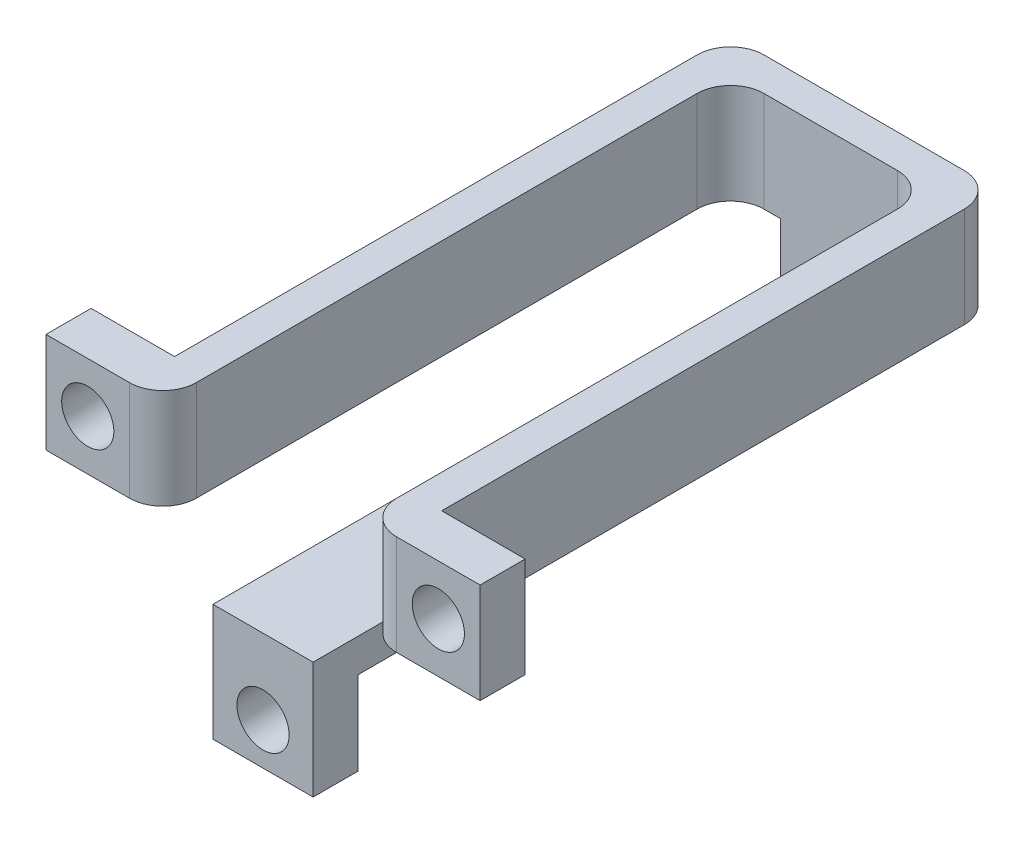
ISO-10303-21;
HEADER;
FILE_DESCRIPTION(('STEP AP214'),'2;1');
FILE_NAME('part.step','',(''),(''),'','','');
FILE_SCHEMA(('AUTOMOTIVE_DESIGN { 1 0 10303 214 1 1 1 1 }'));
ENDSEC;
DATA;
#1=APPLICATION_CONTEXT('core data for automotive mechanical design processes');
#2=APPLICATION_PROTOCOL_DEFINITION('international standard','automotive_design',2000,#1);
#3=PRODUCT_CONTEXT('',#1,'mechanical');
#4=PRODUCT('Part','Part','',(#3));
#5=PRODUCT_RELATED_PRODUCT_CATEGORY('part','',(#4));
#6=PRODUCT_DEFINITION_FORMATION('','',#4);
#7=PRODUCT_DEFINITION_CONTEXT('part definition',#1,'design');
#8=PRODUCT_DEFINITION('design','',#6,#7);
#9=PRODUCT_DEFINITION_SHAPE('','',#8);
#10=(LENGTH_UNIT() NAMED_UNIT(*) SI_UNIT(.MILLI.,.METRE.));
#11=(NAMED_UNIT(*) PLANE_ANGLE_UNIT() SI_UNIT($,.RADIAN.));
#12=(NAMED_UNIT(*) SI_UNIT($,.STERADIAN.) SOLID_ANGLE_UNIT());
#13=UNCERTAINTY_MEASURE_WITH_UNIT(LENGTH_MEASURE(1.E-05),#10,'distance_accuracy_value','');
#14=(GEOMETRIC_REPRESENTATION_CONTEXT(3) GLOBAL_UNCERTAINTY_ASSIGNED_CONTEXT((#13)) GLOBAL_UNIT_ASSIGNED_CONTEXT((#10,
#11,#12)) REPRESENTATION_CONTEXT('',''));
#15=CARTESIAN_POINT('',(0.,0.,0.));
#16=DIRECTION('',(0.,0.,1.));
#17=DIRECTION('',(1.,0.,0.));
#18=AXIS2_PLACEMENT_3D('',#15,#16,#17);
#19=CARTESIAN_POINT('',(38.1,-63.5,215.9));
#20=DIRECTION('',(0.,1.,0.));
#21=DIRECTION('',(0.,0.,1.));
#22=AXIS2_PLACEMENT_3D('',#19,#20,#21);
#23=PLANE('',#22);
#24=DIRECTION('',(1.,0.,0.));
#25=VECTOR('',#24,1.);
#26=CARTESIAN_POINT('',(38.1,-63.5,181.61));
#27=LINE('',#26,#25);
#28=CARTESIAN_POINT('',(-38.1,-63.5,181.61));
#29=VERTEX_POINT('',#28);
#30=CARTESIAN_POINT('',(38.1,-63.5,181.61));
#31=VERTEX_POINT('',#30);
#32=EDGE_CURVE('E61',#29,#31,#27,.T.);
#33=ORIENTED_EDGE('',*,*,#32,.F.);
#34=DIRECTION('',(0.,0.,-1.));
#35=VECTOR('',#34,1.);
#36=CARTESIAN_POINT('',(-38.1,-63.5,215.9));
#37=LINE('',#36,#35);
#38=CARTESIAN_POINT('',(-38.1,-63.5,-241.3));
#39=VERTEX_POINT('',#38);
#40=EDGE_CURVE('E267',#29,#39,#37,.T.);
#41=ORIENTED_EDGE('',*,*,#40,.T.);
#42=DIRECTION('',(-1.,0.,0.));
#43=VECTOR('',#42,1.);
#44=CARTESIAN_POINT('',(38.1,-63.5,-241.3));
#45=LINE('',#44,#43);
#46=CARTESIAN_POINT('',(38.1,-63.5,-241.3));
#47=VERTEX_POINT('',#46);
#48=EDGE_CURVE('E279',#47,#39,#45,.T.);
#49=ORIENTED_EDGE('',*,*,#48,.F.);
#50=DIRECTION('',(0.,0.,-1.));
#51=VECTOR('',#50,1.);
#52=CARTESIAN_POINT('',(38.1,-63.5,215.9));
#53=LINE('',#52,#51);
#54=EDGE_CURVE('E229',#31,#47,#53,.T.);
#55=ORIENTED_EDGE('',*,*,#54,.F.);
#56=EDGE_LOOP('',(#33,#41,#49,#55));
#57=FACE_BOUND('',#56,.T.);
#58=ADVANCED_FACE('F46',(#57),#23,.F.);
#59=CARTESIAN_POINT('',(0.,0.,0.));
#60=DIRECTION('',(0.,-1.,0.));
#61=DIRECTION('',(0.,0.,-1.));
#62=AXIS2_PLACEMENT_3D('',#59,#60,#61);
#63=PLANE('',#62);
#64=DIRECTION('',(1.,0.,0.));
#65=VECTOR('',#64,1.);
#66=CARTESIAN_POINT('',(-76.2,0.,-215.9));
#67=LINE('',#66,#65);
#68=CARTESIAN_POINT('',(38.1,0.,-215.9));
#69=VERTEX_POINT('',#68);
#70=CARTESIAN_POINT('',(50.8,0.,-215.9));
#71=VERTEX_POINT('',#70);
#72=EDGE_CURVE('E68',#69,#71,#67,.T.);
#73=ORIENTED_EDGE('',*,*,#72,.F.);
#74=DIRECTION('',(0.,0.,-1.));
#75=VECTOR('',#74,1.);
#76=CARTESIAN_POINT('',(38.1,0.,0.));
#77=LINE('',#76,#75);
#78=CARTESIAN_POINT('',(38.0999999999999,0.,-241.3));
#79=VERTEX_POINT('',#78);
#80=EDGE_CURVE('E13',#69,#79,#77,.T.);
#81=ORIENTED_EDGE('',*,*,#80,.T.);
#82=DIRECTION('',(-1.,0.,0.));
#83=VECTOR('',#82,1.);
#84=CARTESIAN_POINT('',(-101.6,0.,-241.3));
#85=LINE('',#84,#83);
#86=CARTESIAN_POINT('',(76.2,0.,-241.3));
#87=VERTEX_POINT('',#86);
#88=EDGE_CURVE('E365',#87,#79,#85,.T.);
#89=ORIENTED_EDGE('',*,*,#88,.F.);
#90=CARTESIAN_POINT('',(76.2,0.,-215.9));
#91=DIRECTION('',(0.,-1.,0.));
#92=DIRECTION('',(0.,0.,-1.));
#93=AXIS2_PLACEMENT_3D('',#90,#91,#92);
#94=CIRCLE('',#93,25.4);
#95=CARTESIAN_POINT('',(101.6,0.,-215.9));
#96=VERTEX_POINT('',#95);
#97=EDGE_CURVE('E380',#87,#96,#94,.T.);
#98=ORIENTED_EDGE('',*,*,#97,.T.);
#99=DIRECTION('',(0.,0.,-1.));
#100=VECTOR('',#99,1.);
#101=CARTESIAN_POINT('',(101.6,0.,215.9));
#102=LINE('',#101,#100);
#103=CARTESIAN_POINT('',(101.6,0.,181.61));
#104=VERTEX_POINT('',#103);
#105=EDGE_CURVE('E361',#104,#96,#102,.T.);
#106=ORIENTED_EDGE('',*,*,#105,.F.);
#107=DIRECTION('',(-1.,0.,0.));
#108=VECTOR('',#107,1.);
#109=CARTESIAN_POINT('',(165.1,0.,181.61));
#110=LINE('',#109,#108);
#111=CARTESIAN_POINT('',(165.1,0.,181.61));
#112=VERTEX_POINT('',#111);
#113=EDGE_CURVE('E331',#112,#104,#110,.T.);
#114=ORIENTED_EDGE('',*,*,#113,.F.);
#115=DIRECTION('',(0.,0.,-1.));
#116=VECTOR('',#115,1.);
#117=CARTESIAN_POINT('',(165.1,0.,215.9));
#118=LINE('',#117,#116);
#119=CARTESIAN_POINT('',(165.1,0.,215.9));
#120=VERTEX_POINT('',#119);
#121=EDGE_CURVE('E319',#120,#112,#118,.T.);
#122=ORIENTED_EDGE('',*,*,#121,.F.);
#123=DIRECTION('',(1.,0.,0.));
#124=VECTOR('',#123,1.);
#125=CARTESIAN_POINT('',(101.6,0.,215.9));
#126=LINE('',#125,#124);
#127=CARTESIAN_POINT('',(101.6,0.,215.9));
#128=VERTEX_POINT('',#127);
#129=EDGE_CURVE('E359',#128,#120,#126,.T.);
#130=ORIENTED_EDGE('',*,*,#129,.F.);
#131=CARTESIAN_POINT('',(101.6,0.,190.5));
#132=DIRECTION('',(0.,-1.,0.));
#133=DIRECTION('',(0.,0.,-1.));
#134=AXIS2_PLACEMENT_3D('',#131,#132,#133);
#135=CIRCLE('',#134,25.4);
#136=CARTESIAN_POINT('',(76.2,0.,190.5));
#137=VERTEX_POINT('',#136);
#138=EDGE_CURVE('E385',#128,#137,#135,.T.);
#139=ORIENTED_EDGE('',*,*,#138,.T.);
#140=DIRECTION('',(0.,0.,1.));
#141=VECTOR('',#140,1.);
#142=CARTESIAN_POINT('',(76.2,0.,215.9));
#143=LINE('',#142,#141);
#144=CARTESIAN_POINT('',(76.2,0.,-190.5));
#145=VERTEX_POINT('',#144);
#146=EDGE_CURVE('E334',#145,#137,#143,.T.);
#147=ORIENTED_EDGE('',*,*,#146,.F.);
#148=CARTESIAN_POINT('',(50.8,0.,-190.5));
#149=DIRECTION('',(0.,-1.,0.));
#150=DIRECTION('',(0.,0.,-1.));
#151=AXIS2_PLACEMENT_3D('',#148,#149,#150);
#152=CIRCLE('',#151,25.4);
#153=EDGE_CURVE('E430',#145,#71,#152,.F.);
#154=ORIENTED_EDGE('',*,*,#153,.T.);
#155=EDGE_LOOP('',(#73,#81,#89,#98,#106,#114,#122,#130,#139,#147,#154));
#156=FACE_BOUND('',#155,.T.);
#157=ADVANCED_FACE('F468',(#156),#63,.T.);
#158=CARTESIAN_POINT('',(101.6,76.2,215.9));
#159=DIRECTION('',(-1.,0.,0.));
#160=DIRECTION('',(0.,0.,1.));
#161=AXIS2_PLACEMENT_3D('',#158,#159,#160);
#162=PLANE('',#161);
#163=ORIENTED_EDGE('',*,*,#105,.T.);
#164=DIRECTION('',(0.,-1.,0.));
#165=VECTOR('',#164,1.);
#166=CARTESIAN_POINT('',(101.6,76.2,-215.9));
#167=LINE('',#166,#165);
#168=CARTESIAN_POINT('',(101.6,76.2,-215.9));
#169=VERTEX_POINT('',#168);
#170=EDGE_CURVE('E414',#96,#169,#167,.F.);
#171=ORIENTED_EDGE('',*,*,#170,.T.);
#172=DIRECTION('',(0.,0.,-1.));
#173=VECTOR('',#172,1.);
#174=CARTESIAN_POINT('',(101.6,76.2,215.9));
#175=LINE('',#174,#173);
#176=CARTESIAN_POINT('',(101.6,76.2,181.61));
#177=VERTEX_POINT('',#176);
#178=EDGE_CURVE('E340',#177,#169,#175,.T.);
#179=ORIENTED_EDGE('',*,*,#178,.F.);
#180=DIRECTION('',(0.,1.,0.));
#181=VECTOR('',#180,1.);
#182=CARTESIAN_POINT('',(101.6,76.2,181.61));
#183=LINE('',#182,#181);
#184=EDGE_CURVE('E315',#104,#177,#183,.T.);
#185=ORIENTED_EDGE('',*,*,#184,.F.);
#186=EDGE_LOOP('',(#163,#171,#179,#185));
#187=FACE_BOUND('',#186,.T.);
#188=ADVANCED_FACE('F472',(#187),#162,.F.);
#189=CARTESIAN_POINT('',(76.2,76.2,215.9));
#190=DIRECTION('',(1.,0.,0.));
#191=DIRECTION('',(0.,0.,-1.));
#192=AXIS2_PLACEMENT_3D('',#189,#190,#191);
#193=PLANE('',#192);
#194=DIRECTION('',(0.,0.,1.));
#195=VECTOR('',#194,1.);
#196=CARTESIAN_POINT('',(76.2,76.2,215.9));
#197=LINE('',#196,#195);
#198=CARTESIAN_POINT('',(76.2,76.2,-190.5));
#199=VERTEX_POINT('',#198);
#200=CARTESIAN_POINT('',(76.2,76.2,190.5));
#201=VERTEX_POINT('',#200);
#202=EDGE_CURVE('E335',#199,#201,#197,.T.);
#203=ORIENTED_EDGE('',*,*,#202,.F.);
#204=DIRECTION('',(0.,-1.,0.));
#205=VECTOR('',#204,1.);
#206=CARTESIAN_POINT('',(76.2,0.,-190.5));
#207=LINE('',#206,#205);
#208=EDGE_CURVE('E423',#199,#145,#207,.T.);
#209=ORIENTED_EDGE('',*,*,#208,.T.);
#210=ORIENTED_EDGE('',*,*,#146,.T.);
#211=DIRECTION('',(0.,-1.,0.));
#212=VECTOR('',#211,1.);
#213=CARTESIAN_POINT('',(76.2,76.2,190.5));
#214=LINE('',#213,#212);
#215=EDGE_CURVE('E403',#137,#201,#214,.F.);
#216=ORIENTED_EDGE('',*,*,#215,.T.);
#217=EDGE_LOOP('',(#203,#209,#210,#216));
#218=FACE_BOUND('',#217,.T.);
#219=ADVANCED_FACE('F524',(#218),#193,.F.);
#220=CARTESIAN_POINT('',(101.6,76.2,215.9));
#221=DIRECTION('',(0.,0.,-1.));
#222=DIRECTION('',(-1.,0.,0.));
#223=AXIS2_PLACEMENT_3D('',#220,#221,#222);
#224=PLANE('',#223);
#225=CARTESIAN_POINT('',(133.35,38.1,215.9));
#226=DIRECTION('',(0.,0.,-1.));
#227=DIRECTION('',(-1.,0.,0.));
#228=AXIS2_PLACEMENT_3D('',#225,#226,#227);
#229=CIRCLE('',#228,19.84375);
#230=CARTESIAN_POINT('',(113.50625,38.1,215.9));
#231=VERTEX_POINT('',#230);
#232=EDGE_CURVE('E291',#231,#231,#229,.T.);
#233=ORIENTED_EDGE('',*,*,#232,.T.);
#234=EDGE_LOOP('',(#233));
#235=FACE_BOUND('',#234,.T.);
#236=DIRECTION('',(1.,0.,0.));
#237=VECTOR('',#236,1.);
#238=CARTESIAN_POINT('',(101.6,76.2,215.9));
#239=LINE('',#238,#237);
#240=CARTESIAN_POINT('',(101.6,76.2,215.9));
#241=VERTEX_POINT('',#240);
#242=CARTESIAN_POINT('',(165.1,76.2,215.9));
#243=VERTEX_POINT('',#242);
#244=EDGE_CURVE('E337',#241,#243,#239,.T.);
#245=ORIENTED_EDGE('',*,*,#244,.F.);
#246=DIRECTION('',(0.,-1.,0.));
#247=VECTOR('',#246,1.);
#248=CARTESIAN_POINT('',(101.6,76.2,215.9));
#249=LINE('',#248,#247);
#250=EDGE_CURVE('E400',#241,#128,#249,.T.);
#251=ORIENTED_EDGE('',*,*,#250,.T.);
#252=ORIENTED_EDGE('',*,*,#129,.T.);
#253=DIRECTION('',(0.,-1.,0.));
#254=VECTOR('',#253,1.);
#255=CARTESIAN_POINT('',(165.1,76.2,215.9));
#256=LINE('',#255,#254);
#257=EDGE_CURVE('E316',#243,#120,#256,.T.);
#258=ORIENTED_EDGE('',*,*,#257,.F.);
#259=EDGE_LOOP('',(#245,#251,#252,#258));
#260=FACE_BOUND('',#259,.T.);
#261=ADVANCED_FACE('F521',(#235,#260),#224,.F.);
#262=CARTESIAN_POINT('',(-101.6,76.2,-241.3));
#263=DIRECTION('',(0.,0.,1.));
#264=DIRECTION('',(1.,0.,0.));
#265=AXIS2_PLACEMENT_3D('',#262,#263,#264);
#266=PLANE('',#265);
#267=ORIENTED_EDGE('',*,*,#88,.T.);
#268=DIRECTION('',(0.,1.,0.));
#269=VECTOR('',#268,1.);
#270=CARTESIAN_POINT('',(38.1,-63.5,-241.3));
#271=LINE('',#270,#269);
#272=EDGE_CURVE('E259',#47,#79,#271,.T.);
#273=ORIENTED_EDGE('',*,*,#272,.F.);
#274=ORIENTED_EDGE('',*,*,#48,.T.);
#275=DIRECTION('',(0.,1.,0.));
#276=VECTOR('',#275,1.);
#277=CARTESIAN_POINT('',(-38.1,-63.5,-241.3));
#278=LINE('',#277,#276);
#279=CARTESIAN_POINT('',(-38.1,0.,-241.3));
#280=VERTEX_POINT('',#279);
#281=EDGE_CURVE('E269',#39,#280,#278,.T.);
#282=ORIENTED_EDGE('',*,*,#281,.T.);
#283=CARTESIAN_POINT('',(-76.2,0.,-241.3));
#284=VERTEX_POINT('',#283);
#285=EDGE_CURVE('E364',#280,#284,#85,.T.);
#286=ORIENTED_EDGE('',*,*,#285,.T.);
#287=DIRECTION('',(0.,-1.,0.));
#288=VECTOR('',#287,1.);
#289=CARTESIAN_POINT('',(-76.2,76.2,-241.3));
#290=LINE('',#289,#288);
#291=CARTESIAN_POINT('',(-76.2,76.2,-241.3));
#292=VERTEX_POINT('',#291);
#293=EDGE_CURVE('E412',#284,#292,#290,.F.);
#294=ORIENTED_EDGE('',*,*,#293,.T.);
#295=DIRECTION('',(-1.,0.,0.));
#296=VECTOR('',#295,1.);
#297=CARTESIAN_POINT('',(-101.6,76.2,-241.3));
#298=LINE('',#297,#296);
#299=CARTESIAN_POINT('',(76.2,76.2,-241.3));
#300=VERTEX_POINT('',#299);
#301=EDGE_CURVE('E343',#300,#292,#298,.T.);
#302=ORIENTED_EDGE('',*,*,#301,.F.);
#303=DIRECTION('',(0.,-1.,0.));
#304=VECTOR('',#303,1.);
#305=CARTESIAN_POINT('',(76.2,76.2,-241.3));
#306=LINE('',#305,#304);
#307=EDGE_CURVE('E409',#300,#87,#306,.T.);
#308=ORIENTED_EDGE('',*,*,#307,.T.);
#309=EDGE_LOOP('',(#267,#273,#274,#282,#286,#294,#302,#308));
#310=FACE_BOUND('',#309,.T.);
#311=ADVANCED_FACE('F442',(#310),#266,.F.);
#312=CARTESIAN_POINT('',(-101.6,76.2,215.9));
#313=DIRECTION('',(1.,0.,0.));
#314=DIRECTION('',(0.,0.,-1.));
#315=AXIS2_PLACEMENT_3D('',#312,#313,#314);
#316=PLANE('',#315);
#317=DIRECTION('',(0.,0.,1.));
#318=VECTOR('',#317,1.);
#319=CARTESIAN_POINT('',(-101.6,76.2,215.9));
#320=LINE('',#319,#318);
#321=CARTESIAN_POINT('',(-101.6,76.2,-215.9));
#322=VERTEX_POINT('',#321);
#323=CARTESIAN_POINT('',(-101.6,76.2,181.61));
#324=VERTEX_POINT('',#323);
#325=EDGE_CURVE('E346',#322,#324,#320,.T.);
#326=ORIENTED_EDGE('',*,*,#325,.F.);
#327=DIRECTION('',(0.,-1.,0.));
#328=VECTOR('',#327,1.);
#329=CARTESIAN_POINT('',(-101.6,76.2,-215.9));
#330=LINE('',#329,#328);
#331=CARTESIAN_POINT('',(-101.6,0.,-215.9));
#332=VERTEX_POINT('',#331);
#333=EDGE_CURVE('E406',#322,#332,#330,.T.);
#334=ORIENTED_EDGE('',*,*,#333,.T.);
#335=DIRECTION('',(0.,0.,1.));
#336=VECTOR('',#335,1.);
#337=CARTESIAN_POINT('',(-101.6,0.,215.9));
#338=LINE('',#337,#336);
#339=CARTESIAN_POINT('',(-101.6,0.,181.61));
#340=VERTEX_POINT('',#339);
#341=EDGE_CURVE('E368',#332,#340,#338,.T.);
#342=ORIENTED_EDGE('',*,*,#341,.T.);
#343=DIRECTION('',(0.,1.,0.));
#344=VECTOR('',#343,1.);
#345=CARTESIAN_POINT('',(-101.6,76.2,181.61));
#346=LINE('',#345,#344);
#347=EDGE_CURVE('E294',#340,#324,#346,.T.);
#348=ORIENTED_EDGE('',*,*,#347,.T.);
#349=EDGE_LOOP('',(#326,#334,#342,#348));
#350=FACE_BOUND('',#349,.T.);
#351=ADVANCED_FACE('F514',(#350),#316,.F.);
#352=CARTESIAN_POINT('',(-101.6,76.2,215.9));
#353=DIRECTION('',(0.,0.,-1.));
#354=DIRECTION('',(-1.,0.,0.));
#355=AXIS2_PLACEMENT_3D('',#352,#353,#354);
#356=PLANE('',#355);
#357=CARTESIAN_POINT('',(-133.35,38.1,215.9));
#358=DIRECTION('',(0.,0.,-1.));
#359=DIRECTION('',(-1.,0.,0.));
#360=AXIS2_PLACEMENT_3D('',#357,#358,#359);
#361=CIRCLE('',#360,19.84375);
#362=CARTESIAN_POINT('',(-153.19375,38.1,215.9));
#363=VERTEX_POINT('',#362);
#364=EDGE_CURVE('E285',#363,#363,#361,.T.);
#365=ORIENTED_EDGE('',*,*,#364,.T.);
#366=EDGE_LOOP('',(#365));
#367=FACE_BOUND('',#366,.T.);
#368=DIRECTION('',(1.,0.,0.));
#369=VECTOR('',#368,1.);
#370=CARTESIAN_POINT('',(-101.6,0.,215.9));
#371=LINE('',#370,#369);
#372=CARTESIAN_POINT('',(-165.1,0.,215.9));
#373=VERTEX_POINT('',#372);
#374=CARTESIAN_POINT('',(-101.6,0.,215.9));
#375=VERTEX_POINT('',#374);
#376=EDGE_CURVE('E370',#373,#375,#371,.T.);
#377=ORIENTED_EDGE('',*,*,#376,.T.);
#378=DIRECTION('',(0.,-1.,0.));
#379=VECTOR('',#378,1.);
#380=CARTESIAN_POINT('',(-101.6,76.2,215.9));
#381=LINE('',#380,#379);
#382=CARTESIAN_POINT('',(-101.6,76.2,215.9));
#383=VERTEX_POINT('',#382);
#384=EDGE_CURVE('E390',#375,#383,#381,.F.);
#385=ORIENTED_EDGE('',*,*,#384,.T.);
#386=DIRECTION('',(1.,0.,0.));
#387=VECTOR('',#386,1.);
#388=CARTESIAN_POINT('',(-101.6,76.2,215.9));
#389=LINE('',#388,#387);
#390=CARTESIAN_POINT('',(-165.1,76.2,215.9));
#391=VERTEX_POINT('',#390);
#392=EDGE_CURVE('E348',#391,#383,#389,.T.);
#393=ORIENTED_EDGE('',*,*,#392,.F.);
#394=DIRECTION('',(0.,-1.,0.));
#395=VECTOR('',#394,1.);
#396=CARTESIAN_POINT('',(-165.1,76.2,215.9));
#397=LINE('',#396,#395);
#398=EDGE_CURVE('E295',#391,#373,#397,.T.);
#399=ORIENTED_EDGE('',*,*,#398,.T.);
#400=EDGE_LOOP('',(#377,#385,#393,#399));
#401=FACE_BOUND('',#400,.T.);
#402=ADVANCED_FACE('F510',(#367,#401),#356,.F.);
#403=CARTESIAN_POINT('',(-76.2,76.2,215.9));
#404=DIRECTION('',(-1.,0.,0.));
#405=DIRECTION('',(0.,0.,1.));
#406=AXIS2_PLACEMENT_3D('',#403,#404,#405);
#407=PLANE('',#406);
#408=DIRECTION('',(0.,0.,-1.));
#409=VECTOR('',#408,1.);
#410=CARTESIAN_POINT('',(-76.2,0.,215.9));
#411=LINE('',#410,#409);
#412=CARTESIAN_POINT('',(-76.2,0.,190.5));
#413=VERTEX_POINT('',#412);
#414=CARTESIAN_POINT('',(-76.2,0.,-190.5));
#415=VERTEX_POINT('',#414);
#416=EDGE_CURVE('E373',#413,#415,#411,.T.);
#417=ORIENTED_EDGE('',*,*,#416,.T.);
#418=DIRECTION('',(0.,-1.,0.));
#419=VECTOR('',#418,1.);
#420=CARTESIAN_POINT('',(-76.2,76.2,-190.5));
#421=LINE('',#420,#419);
#422=CARTESIAN_POINT('',(-76.2,76.2,-190.5));
#423=VERTEX_POINT('',#422);
#424=EDGE_CURVE('E421',#415,#423,#421,.F.);
#425=ORIENTED_EDGE('',*,*,#424,.T.);
#426=DIRECTION('',(0.,0.,-1.));
#427=VECTOR('',#426,1.);
#428=CARTESIAN_POINT('',(-76.2,76.2,215.9));
#429=LINE('',#428,#427);
#430=CARTESIAN_POINT('',(-76.2,76.2,190.5));
#431=VERTEX_POINT('',#430);
#432=EDGE_CURVE('E351',#431,#423,#429,.T.);
#433=ORIENTED_EDGE('',*,*,#432,.F.);
#434=DIRECTION('',(0.,-1.,0.));
#435=VECTOR('',#434,1.);
#436=CARTESIAN_POINT('',(-76.2,76.2,190.5));
#437=LINE('',#436,#435);
#438=EDGE_CURVE('E357',#431,#413,#437,.T.);
#439=ORIENTED_EDGE('',*,*,#438,.T.);
#440=EDGE_LOOP('',(#417,#425,#433,#439));
#441=FACE_BOUND('',#440,.T.);
#442=ADVANCED_FACE('F507',(#441),#407,.F.);
#443=CARTESIAN_POINT('',(-76.2,76.2,-215.9));
#444=DIRECTION('',(0.,0.,-1.));
#445=DIRECTION('',(-1.,0.,0.));
#446=AXIS2_PLACEMENT_3D('',#443,#444,#445);
#447=PLANE('',#446);
#448=DIRECTION('',(0.,-1.,0.));
#449=VECTOR('',#448,1.);
#450=CARTESIAN_POINT('',(38.1,-38.1,-215.9));
#451=LINE('',#450,#449);
#452=CARTESIAN_POINT('',(38.1,-38.1,-215.9));
#453=VERTEX_POINT('',#452);
#454=EDGE_CURVE('E262',#69,#453,#451,.T.);
#455=ORIENTED_EDGE('',*,*,#454,.F.);
#456=ORIENTED_EDGE('',*,*,#72,.T.);
#457=DIRECTION('',(0.,-1.,0.));
#458=VECTOR('',#457,1.);
#459=CARTESIAN_POINT('',(50.8,76.2,-215.9));
#460=LINE('',#459,#458);
#461=CARTESIAN_POINT('',(50.8,76.2,-215.9));
#462=VERTEX_POINT('',#461);
#463=EDGE_CURVE('E416',#71,#462,#460,.F.);
#464=ORIENTED_EDGE('',*,*,#463,.T.);
#465=DIRECTION('',(1.,0.,0.));
#466=VECTOR('',#465,1.);
#467=CARTESIAN_POINT('',(-76.2,76.2,-215.9));
#468=LINE('',#467,#466);
#469=CARTESIAN_POINT('',(-50.8,76.2,-215.9));
#470=VERTEX_POINT('',#469);
#471=EDGE_CURVE('E354',#470,#462,#468,.T.);
#472=ORIENTED_EDGE('',*,*,#471,.F.);
#473=DIRECTION('',(0.,-1.,0.));
#474=VECTOR('',#473,1.);
#475=CARTESIAN_POINT('',(-50.8,0.,-215.9));
#476=LINE('',#475,#474);
#477=CARTESIAN_POINT('',(-50.8,0.,-215.9));
#478=VERTEX_POINT('',#477);
#479=EDGE_CURVE('E418',#470,#478,#476,.T.);
#480=ORIENTED_EDGE('',*,*,#479,.T.);
#481=CARTESIAN_POINT('',(-38.1,0.,-215.9));
#482=VERTEX_POINT('',#481);
#483=EDGE_CURVE('E338',#478,#482,#67,.T.);
#484=ORIENTED_EDGE('',*,*,#483,.T.);
#485=DIRECTION('',(0.,-1.,0.));
#486=VECTOR('',#485,1.);
#487=CARTESIAN_POINT('',(-38.1,-38.1,-215.9));
#488=LINE('',#487,#486);
#489=CARTESIAN_POINT('',(-38.1,-38.1,-215.9));
#490=VERTEX_POINT('',#489);
#491=EDGE_CURVE('E272',#482,#490,#488,.T.);
#492=ORIENTED_EDGE('',*,*,#491,.T.);
#493=DIRECTION('',(-1.,0.,0.));
#494=VECTOR('',#493,1.);
#495=CARTESIAN_POINT('',(38.1,-38.1,-215.9));
#496=LINE('',#495,#494);
#497=EDGE_CURVE('E276',#453,#490,#496,.T.);
#498=ORIENTED_EDGE('',*,*,#497,.F.);
#499=EDGE_LOOP('',(#455,#456,#464,#472,#480,#484,#492,#498));
#500=FACE_BOUND('',#499,.T.);
#501=ADVANCED_FACE('F452',(#500),#447,.F.);
#502=CARTESIAN_POINT('',(0.,76.2,0.));
#503=DIRECTION('',(0.,-1.,0.));
#504=DIRECTION('',(0.,0.,-1.));
#505=AXIS2_PLACEMENT_3D('',#502,#503,#504);
#506=PLANE('',#505);
#507=ORIENTED_EDGE('',*,*,#392,.T.);
#508=CARTESIAN_POINT('',(-101.6,76.2,190.5));
#509=DIRECTION('',(0.,-1.,0.));
#510=DIRECTION('',(0.,0.,-1.));
#511=AXIS2_PLACEMENT_3D('',#508,#509,#510);
#512=CIRCLE('',#511,25.4);
#513=EDGE_CURVE('E398',#383,#431,#512,.F.);
#514=ORIENTED_EDGE('',*,*,#513,.T.);
#515=ORIENTED_EDGE('',*,*,#432,.T.);
#516=CARTESIAN_POINT('',(-50.8,76.2,-190.5));
#517=DIRECTION('',(0.,-1.,0.));
#518=DIRECTION('',(0.,0.,-1.));
#519=AXIS2_PLACEMENT_3D('',#516,#517,#518);
#520=CIRCLE('',#519,25.4);
#521=EDGE_CURVE('E428',#423,#470,#520,.T.);
#522=ORIENTED_EDGE('',*,*,#521,.T.);
#523=ORIENTED_EDGE('',*,*,#471,.T.);
#524=CARTESIAN_POINT('',(50.8,76.2,-190.5));
#525=DIRECTION('',(0.,-1.,0.));
#526=DIRECTION('',(0.,0.,-1.));
#527=AXIS2_PLACEMENT_3D('',#524,#525,#526);
#528=CIRCLE('',#527,25.4);
#529=EDGE_CURVE('E432',#462,#199,#528,.T.);
#530=ORIENTED_EDGE('',*,*,#529,.T.);
#531=ORIENTED_EDGE('',*,*,#202,.T.);
#532=CARTESIAN_POINT('',(101.6,76.2,190.5));
#533=DIRECTION('',(0.,-1.,0.));
#534=DIRECTION('',(0.,0.,-1.));
#535=AXIS2_PLACEMENT_3D('',#532,#533,#534);
#536=CIRCLE('',#535,25.4);
#537=EDGE_CURVE('E396',#201,#241,#536,.F.);
#538=ORIENTED_EDGE('',*,*,#537,.T.);
#539=ORIENTED_EDGE('',*,*,#244,.T.);
#540=DIRECTION('',(0.,0.,1.));
#541=VECTOR('',#540,1.);
#542=CARTESIAN_POINT('',(165.1,76.2,215.9));
#543=LINE('',#542,#541);
#544=CARTESIAN_POINT('',(165.1,76.2,181.61));
#545=VERTEX_POINT('',#544);
#546=EDGE_CURVE('E323',#545,#243,#543,.T.);
#547=ORIENTED_EDGE('',*,*,#546,.F.);
#548=DIRECTION('',(-1.,0.,0.));
#549=VECTOR('',#548,1.);
#550=CARTESIAN_POINT('',(165.1,76.2,181.61));
#551=LINE('',#550,#549);
#552=EDGE_CURVE('E326',#545,#177,#551,.T.);
#553=ORIENTED_EDGE('',*,*,#552,.T.);
#554=ORIENTED_EDGE('',*,*,#178,.T.);
#555=CARTESIAN_POINT('',(76.2,76.2,-215.9));
#556=DIRECTION('',(0.,-1.,0.));
#557=DIRECTION('',(0.,0.,-1.));
#558=AXIS2_PLACEMENT_3D('',#555,#556,#557);
#559=CIRCLE('',#558,25.4);
#560=EDGE_CURVE('E392',#169,#300,#559,.F.);
#561=ORIENTED_EDGE('',*,*,#560,.T.);
#562=ORIENTED_EDGE('',*,*,#301,.T.);
#563=CARTESIAN_POINT('',(-76.2,76.2,-215.9));
#564=DIRECTION('',(0.,-1.,0.));
#565=DIRECTION('',(0.,0.,-1.));
#566=AXIS2_PLACEMENT_3D('',#563,#564,#565);
#567=CIRCLE('',#566,25.4);
#568=EDGE_CURVE('E394',#292,#322,#567,.F.);
#569=ORIENTED_EDGE('',*,*,#568,.T.);
#570=ORIENTED_EDGE('',*,*,#325,.T.);
#571=DIRECTION('',(1.,0.,0.));
#572=VECTOR('',#571,1.);
#573=CARTESIAN_POINT('',(-165.1,76.2,181.61));
#574=LINE('',#573,#572);
#575=CARTESIAN_POINT('',(-165.1,76.2,181.61));
#576=VERTEX_POINT('',#575);
#577=EDGE_CURVE('E312',#576,#324,#574,.T.);
#578=ORIENTED_EDGE('',*,*,#577,.F.);
#579=DIRECTION('',(0.,0.,1.));
#580=VECTOR('',#579,1.);
#581=CARTESIAN_POINT('',(-165.1,76.2,215.9));
#582=LINE('',#581,#580);
#583=EDGE_CURVE('E298',#576,#391,#582,.T.);
#584=ORIENTED_EDGE('',*,*,#583,.T.);
#585=EDGE_LOOP('',(#507,#514,#515,#522,#523,#530,#531,#538,#539,#547,#553,#554,#561,#562,#569,
#570,#578,#584));
#586=FACE_BOUND('',#585,.T.);
#587=ADVANCED_FACE('F500',(#586),#506,.F.);
#588=DIRECTION('',(0.,0.,-1.));
#589=VECTOR('',#588,1.);
#590=CARTESIAN_POINT('',(-38.1,0.,0.));
#591=LINE('',#590,#589);
#592=EDGE_CURVE('E54',#482,#280,#591,.T.);
#593=ORIENTED_EDGE('',*,*,#592,.F.);
#594=ORIENTED_EDGE('',*,*,#483,.F.);
#595=CARTESIAN_POINT('',(-50.8,0.,-190.5));
#596=DIRECTION('',(0.,-1.,0.));
#597=DIRECTION('',(0.,0.,-1.));
#598=AXIS2_PLACEMENT_3D('',#595,#596,#597);
#599=CIRCLE('',#598,25.4);
#600=EDGE_CURVE('E426',#478,#415,#599,.F.);
#601=ORIENTED_EDGE('',*,*,#600,.T.);
#602=ORIENTED_EDGE('',*,*,#416,.F.);
#603=CARTESIAN_POINT('',(-101.6,0.,190.5));
#604=DIRECTION('',(0.,-1.,0.));
#605=DIRECTION('',(0.,0.,-1.));
#606=AXIS2_PLACEMENT_3D('',#603,#604,#605);
#607=CIRCLE('',#606,25.4);
#608=EDGE_CURVE('E388',#413,#375,#607,.T.);
#609=ORIENTED_EDGE('',*,*,#608,.T.);
#610=ORIENTED_EDGE('',*,*,#376,.F.);
#611=DIRECTION('',(0.,0.,-1.));
#612=VECTOR('',#611,1.);
#613=CARTESIAN_POINT('',(-165.1,0.,215.9));
#614=LINE('',#613,#612);
#615=CARTESIAN_POINT('',(-165.1,0.,181.61));
#616=VERTEX_POINT('',#615);
#617=EDGE_CURVE('E304',#373,#616,#614,.T.);
#618=ORIENTED_EDGE('',*,*,#617,.T.);
#619=DIRECTION('',(1.,0.,0.));
#620=VECTOR('',#619,1.);
#621=CARTESIAN_POINT('',(-165.1,0.,181.61));
#622=LINE('',#621,#620);
#623=EDGE_CURVE('E307',#616,#340,#622,.T.);
#624=ORIENTED_EDGE('',*,*,#623,.T.);
#625=ORIENTED_EDGE('',*,*,#341,.F.);
#626=CARTESIAN_POINT('',(-76.2,0.,-215.9));
#627=DIRECTION('',(0.,-1.,0.));
#628=DIRECTION('',(0.,0.,-1.));
#629=AXIS2_PLACEMENT_3D('',#626,#627,#628);
#630=CIRCLE('',#629,25.4);
#631=EDGE_CURVE('E382',#332,#284,#630,.T.);
#632=ORIENTED_EDGE('',*,*,#631,.T.);
#633=ORIENTED_EDGE('',*,*,#285,.F.);
#634=EDGE_LOOP('',(#593,#594,#601,#602,#609,#610,#618,#624,#625,#632,#633));
#635=FACE_BOUND('',#634,.T.);
#636=ADVANCED_FACE('F474',(#635),#63,.T.);
#637=CARTESIAN_POINT('',(165.1,76.2,181.61));
#638=DIRECTION('',(0.,0.,1.));
#639=DIRECTION('',(1.,0.,0.));
#640=AXIS2_PLACEMENT_3D('',#637,#638,#639);
#641=PLANE('',#640);
#642=CARTESIAN_POINT('',(133.35,38.1,181.61));
#643=DIRECTION('',(0.,0.,-1.));
#644=DIRECTION('',(-1.,0.,0.));
#645=AXIS2_PLACEMENT_3D('',#642,#643,#644);
#646=CIRCLE('',#645,19.84375);
#647=CARTESIAN_POINT('',(113.50625,38.1,181.61));
#648=VERTEX_POINT('',#647);
#649=EDGE_CURVE('E288',#648,#648,#646,.T.);
#650=ORIENTED_EDGE('',*,*,#649,.F.);
#651=EDGE_LOOP('',(#650));
#652=FACE_BOUND('',#651,.T.);
#653=ORIENTED_EDGE('',*,*,#184,.T.);
#654=ORIENTED_EDGE('',*,*,#552,.F.);
#655=DIRECTION('',(0.,1.,0.));
#656=VECTOR('',#655,1.);
#657=CARTESIAN_POINT('',(165.1,76.2,181.61));
#658=LINE('',#657,#656);
#659=EDGE_CURVE('E321',#112,#545,#658,.T.);
#660=ORIENTED_EDGE('',*,*,#659,.F.);
#661=ORIENTED_EDGE('',*,*,#113,.T.);
#662=EDGE_LOOP('',(#653,#654,#660,#661));
#663=FACE_BOUND('',#662,.T.);
#664=ADVANCED_FACE('F495',(#652,#663),#641,.F.);
#665=CARTESIAN_POINT('',(165.1,0.,0.));
#666=DIRECTION('',(1.,0.,0.));
#667=DIRECTION('',(0.,0.,-1.));
#668=AXIS2_PLACEMENT_3D('',#665,#666,#667);
#669=PLANE('',#668);
#670=ORIENTED_EDGE('',*,*,#257,.T.);
#671=ORIENTED_EDGE('',*,*,#121,.T.);
#672=ORIENTED_EDGE('',*,*,#659,.T.);
#673=ORIENTED_EDGE('',*,*,#546,.T.);
#674=EDGE_LOOP('',(#670,#671,#672,#673));
#675=FACE_BOUND('',#674,.T.);
#676=ADVANCED_FACE('F491',(#675),#669,.T.);
#677=CARTESIAN_POINT('',(-165.1,76.2,181.61));
#678=DIRECTION('',(0.,0.,-1.));
#679=DIRECTION('',(-1.,0.,0.));
#680=AXIS2_PLACEMENT_3D('',#677,#678,#679);
#681=PLANE('',#680);
#682=CARTESIAN_POINT('',(-133.35,38.1,181.61));
#683=DIRECTION('',(0.,0.,-1.));
#684=DIRECTION('',(-1.,0.,0.));
#685=AXIS2_PLACEMENT_3D('',#682,#683,#684);
#686=CIRCLE('',#685,19.84375);
#687=CARTESIAN_POINT('',(-153.19375,38.1,181.61));
#688=VERTEX_POINT('',#687);
#689=EDGE_CURVE('E282',#688,#688,#686,.T.);
#690=ORIENTED_EDGE('',*,*,#689,.F.);
#691=EDGE_LOOP('',(#690));
#692=FACE_BOUND('',#691,.T.);
#693=ORIENTED_EDGE('',*,*,#347,.F.);
#694=ORIENTED_EDGE('',*,*,#623,.F.);
#695=DIRECTION('',(0.,1.,0.));
#696=VECTOR('',#695,1.);
#697=CARTESIAN_POINT('',(-165.1,76.2,181.61));
#698=LINE('',#697,#696);
#699=EDGE_CURVE('E301',#616,#576,#698,.T.);
#700=ORIENTED_EDGE('',*,*,#699,.T.);
#701=ORIENTED_EDGE('',*,*,#577,.T.);
#702=EDGE_LOOP('',(#693,#694,#700,#701));
#703=FACE_BOUND('',#702,.T.);
#704=ADVANCED_FACE('F487',(#692,#703),#681,.T.);
#705=CARTESIAN_POINT('',(-165.1,0.,0.));
#706=DIRECTION('',(-1.,0.,0.));
#707=DIRECTION('',(0.,0.,-1.));
#708=AXIS2_PLACEMENT_3D('',#705,#706,#707);
#709=PLANE('',#708);
#710=ORIENTED_EDGE('',*,*,#398,.F.);
#711=ORIENTED_EDGE('',*,*,#583,.F.);
#712=ORIENTED_EDGE('',*,*,#699,.F.);
#713=ORIENTED_EDGE('',*,*,#617,.F.);
#714=EDGE_LOOP('',(#710,#711,#712,#713));
#715=FACE_BOUND('',#714,.T.);
#716=ADVANCED_FACE('F483',(#715),#709,.T.);
#717=CARTESIAN_POINT('',(-101.6,76.2,190.5));
#718=DIRECTION('',(0.,-1.,0.));
#719=DIRECTION('',(0.,0.,-1.));
#720=AXIS2_PLACEMENT_3D('',#717,#718,#719);
#721=CYLINDRICAL_SURFACE('',#720,25.4);
#722=ORIENTED_EDGE('',*,*,#513,.F.);
#723=ORIENTED_EDGE('',*,*,#384,.F.);
#724=ORIENTED_EDGE('',*,*,#608,.F.);
#725=ORIENTED_EDGE('',*,*,#438,.F.);
#726=EDGE_LOOP('',(#722,#723,#724,#725));
#727=FACE_BOUND('',#726,.T.);
#728=ADVANCED_FACE('F486',(#727),#721,.T.);
#729=CARTESIAN_POINT('',(101.6,76.2,190.5));
#730=DIRECTION('',(0.,-1.,0.));
#731=DIRECTION('',(0.,0.,-1.));
#732=AXIS2_PLACEMENT_3D('',#729,#730,#731);
#733=CYLINDRICAL_SURFACE('',#732,25.4);
#734=ORIENTED_EDGE('',*,*,#537,.F.);
#735=ORIENTED_EDGE('',*,*,#215,.F.);
#736=ORIENTED_EDGE('',*,*,#138,.F.);
#737=ORIENTED_EDGE('',*,*,#250,.F.);
#738=EDGE_LOOP('',(#734,#735,#736,#737));
#739=FACE_BOUND('',#738,.T.);
#740=ADVANCED_FACE('F534',(#739),#733,.T.);
#741=CARTESIAN_POINT('',(-76.2,76.2,-215.9));
#742=DIRECTION('',(0.,-1.,0.));
#743=DIRECTION('',(0.,0.,-1.));
#744=AXIS2_PLACEMENT_3D('',#741,#742,#743);
#745=CYLINDRICAL_SURFACE('',#744,25.4);
#746=ORIENTED_EDGE('',*,*,#568,.F.);
#747=ORIENTED_EDGE('',*,*,#293,.F.);
#748=ORIENTED_EDGE('',*,*,#631,.F.);
#749=ORIENTED_EDGE('',*,*,#333,.F.);
#750=EDGE_LOOP('',(#746,#747,#748,#749));
#751=FACE_BOUND('',#750,.T.);
#752=ADVANCED_FACE('F538',(#751),#745,.T.);
#753=CARTESIAN_POINT('',(76.2,76.2,-215.9));
#754=DIRECTION('',(0.,-1.,0.));
#755=DIRECTION('',(0.,0.,-1.));
#756=AXIS2_PLACEMENT_3D('',#753,#754,#755);
#757=CYLINDRICAL_SURFACE('',#756,25.4);
#758=ORIENTED_EDGE('',*,*,#560,.F.);
#759=ORIENTED_EDGE('',*,*,#170,.F.);
#760=ORIENTED_EDGE('',*,*,#97,.F.);
#761=ORIENTED_EDGE('',*,*,#307,.F.);
#762=EDGE_LOOP('',(#758,#759,#760,#761));
#763=FACE_BOUND('',#762,.T.);
#764=ADVANCED_FACE('F542',(#763),#757,.T.);
#765=CARTESIAN_POINT('',(-50.8,76.2,-190.5));
#766=DIRECTION('',(0.,1.,0.));
#767=DIRECTION('',(0.,0.,1.));
#768=AXIS2_PLACEMENT_3D('',#765,#766,#767);
#769=CYLINDRICAL_SURFACE('',#768,25.4);
#770=ORIENTED_EDGE('',*,*,#521,.F.);
#771=ORIENTED_EDGE('',*,*,#424,.F.);
#772=ORIENTED_EDGE('',*,*,#600,.F.);
#773=ORIENTED_EDGE('',*,*,#479,.F.);
#774=EDGE_LOOP('',(#770,#771,#772,#773));
#775=FACE_BOUND('',#774,.T.);
#776=ADVANCED_FACE('F545',(#775),#769,.F.);
#777=CARTESIAN_POINT('',(50.8,76.2,-190.5));
#778=DIRECTION('',(0.,1.,0.));
#779=DIRECTION('',(0.,0.,1.));
#780=AXIS2_PLACEMENT_3D('',#777,#778,#779);
#781=CYLINDRICAL_SURFACE('',#780,25.4);
#782=ORIENTED_EDGE('',*,*,#529,.F.);
#783=ORIENTED_EDGE('',*,*,#463,.F.);
#784=ORIENTED_EDGE('',*,*,#153,.F.);
#785=ORIENTED_EDGE('',*,*,#208,.F.);
#786=EDGE_LOOP('',(#782,#783,#784,#785));
#787=FACE_BOUND('',#786,.T.);
#788=ADVANCED_FACE('F48',(#787),#781,.F.);
#789=CARTESIAN_POINT('',(133.35,38.1,181.61));
#790=DIRECTION('',(0.,0.,-1.));
#791=DIRECTION('',(-1.,0.,0.));
#792=AXIS2_PLACEMENT_3D('',#789,#790,#791);
#793=CYLINDRICAL_SURFACE('',#792,19.84375);
#794=ORIENTED_EDGE('',*,*,#232,.F.);
#795=EDGE_LOOP('',(#794));
#796=FACE_BOUND('',#795,.T.);
#797=ORIENTED_EDGE('',*,*,#649,.T.);
#798=EDGE_LOOP('',(#797));
#799=FACE_BOUND('',#798,.T.);
#800=ADVANCED_FACE('F478',(#796,#799),#793,.F.);
#801=CARTESIAN_POINT('',(-133.35,38.1,181.61));
#802=DIRECTION('',(0.,0.,-1.));
#803=DIRECTION('',(-1.,0.,0.));
#804=AXIS2_PLACEMENT_3D('',#801,#802,#803);
#805=CYLINDRICAL_SURFACE('',#804,19.84375);
#806=ORIENTED_EDGE('',*,*,#364,.F.);
#807=EDGE_LOOP('',(#806));
#808=FACE_BOUND('',#807,.T.);
#809=ORIENTED_EDGE('',*,*,#689,.T.);
#810=EDGE_LOOP('',(#809));
#811=FACE_BOUND('',#810,.T.);
#812=ADVANCED_FACE('F462',(#808,#811),#805,.F.);
#813=CARTESIAN_POINT('',(38.1,-63.5,215.9));
#814=DIRECTION('',(0.,0.,-1.));
#815=DIRECTION('',(-1.,0.,0.));
#816=AXIS2_PLACEMENT_3D('',#813,#814,#815);
#817=PLANE('',#816);
#818=CARTESIAN_POINT('',(0.,-95.2212607327803,215.9));
#819=DIRECTION('',(0.,0.,-1.));
#820=DIRECTION('',(-1.,0.,0.));
#821=AXIS2_PLACEMENT_3D('',#818,#819,#820);
#822=CIRCLE('',#821,19.84375);
#823=CARTESIAN_POINT('',(-19.84375,-95.2212607327803,215.9));
#824=VERTEX_POINT('',#823);
#825=EDGE_CURVE('E246',#824,#824,#822,.T.);
#826=ORIENTED_EDGE('',*,*,#825,.T.);
#827=EDGE_LOOP('',(#826));
#828=FACE_BOUND('',#827,.T.);
#829=DIRECTION('',(0.,-1.,0.));
#830=VECTOR('',#829,1.);
#831=CARTESIAN_POINT('',(-38.1,-63.5,215.9));
#832=LINE('',#831,#830);
#833=CARTESIAN_POINT('',(-38.1,-38.1,215.9));
#834=VERTEX_POINT('',#833);
#835=CARTESIAN_POINT('',(-38.1,-127.,215.9));
#836=VERTEX_POINT('',#835);
#837=EDGE_CURVE('E236',#834,#836,#832,.T.);
#838=ORIENTED_EDGE('',*,*,#837,.T.);
#839=DIRECTION('',(-1.,0.,0.));
#840=VECTOR('',#839,1.);
#841=CARTESIAN_POINT('',(38.1,-127.,215.9));
#842=LINE('',#841,#840);
#843=CARTESIAN_POINT('',(38.1,-127.,215.9));
#844=VERTEX_POINT('',#843);
#845=EDGE_CURVE('E233',#844,#836,#842,.T.);
#846=ORIENTED_EDGE('',*,*,#845,.F.);
#847=DIRECTION('',(0.,-1.,0.));
#848=VECTOR('',#847,1.);
#849=CARTESIAN_POINT('',(38.1,-63.5,215.9));
#850=LINE('',#849,#848);
#851=CARTESIAN_POINT('',(38.1,-38.1,215.9));
#852=VERTEX_POINT('',#851);
#853=EDGE_CURVE('E218',#852,#844,#850,.T.);
#854=ORIENTED_EDGE('',*,*,#853,.F.);
#855=DIRECTION('',(-1.,0.,0.));
#856=VECTOR('',#855,1.);
#857=CARTESIAN_POINT('',(38.1,-38.1,215.9));
#858=LINE('',#857,#856);
#859=EDGE_CURVE('E265',#852,#834,#858,.T.);
#860=ORIENTED_EDGE('',*,*,#859,.T.);
#861=EDGE_LOOP('',(#838,#846,#854,#860));
#862=FACE_BOUND('',#861,.T.);
#863=ADVANCED_FACE('F234',(#828,#862),#817,.F.);
#864=CARTESIAN_POINT('',(38.1,-38.1,215.9));
#865=DIRECTION('',(0.,-1.,0.));
#866=DIRECTION('',(0.,0.,-1.));
#867=AXIS2_PLACEMENT_3D('',#864,#865,#866);
#868=PLANE('',#867);
#869=DIRECTION('',(0.,0.,1.));
#870=VECTOR('',#869,1.);
#871=CARTESIAN_POINT('',(-38.1,-38.1,215.9));
#872=LINE('',#871,#870);
#873=EDGE_CURVE('E230',#490,#834,#872,.T.);
#874=ORIENTED_EDGE('',*,*,#873,.T.);
#875=ORIENTED_EDGE('',*,*,#859,.F.);
#876=DIRECTION('',(0.,0.,1.));
#877=VECTOR('',#876,1.);
#878=CARTESIAN_POINT('',(38.1,-38.1,215.9));
#879=LINE('',#878,#877);
#880=EDGE_CURVE('E225',#453,#852,#879,.T.);
#881=ORIENTED_EDGE('',*,*,#880,.F.);
#882=ORIENTED_EDGE('',*,*,#497,.T.);
#883=EDGE_LOOP('',(#874,#875,#881,#882));
#884=FACE_BOUND('',#883,.T.);
#885=ADVANCED_FACE('F454',(#884),#868,.F.);
#886=CARTESIAN_POINT('',(38.1,0.,0.));
#887=DIRECTION('',(-1.,0.,0.));
#888=DIRECTION('',(0.,0.,1.));
#889=AXIS2_PLACEMENT_3D('',#886,#887,#888);
#890=PLANE('',#889);
#891=ORIENTED_EDGE('',*,*,#80,.F.);
#892=ORIENTED_EDGE('',*,*,#454,.T.);
#893=ORIENTED_EDGE('',*,*,#880,.T.);
#894=ORIENTED_EDGE('',*,*,#853,.T.);
#895=DIRECTION('',(0.,0.,1.));
#896=VECTOR('',#895,1.);
#897=CARTESIAN_POINT('',(38.1,-127.,215.9));
#898=LINE('',#897,#896);
#899=CARTESIAN_POINT('',(38.1,-127.,181.61));
#900=VERTEX_POINT('',#899);
#901=EDGE_CURVE('E223',#900,#844,#898,.T.);
#902=ORIENTED_EDGE('',*,*,#901,.F.);
#903=DIRECTION('',(0.,1.,0.));
#904=VECTOR('',#903,1.);
#905=CARTESIAN_POINT('',(38.1,-127.,181.61));
#906=LINE('',#905,#904);
#907=EDGE_CURVE('E252',#900,#31,#906,.T.);
#908=ORIENTED_EDGE('',*,*,#907,.T.);
#909=ORIENTED_EDGE('',*,*,#54,.T.);
#910=ORIENTED_EDGE('',*,*,#272,.T.);
#911=EDGE_LOOP('',(#891,#892,#893,#894,#902,#908,#909,#910));
#912=FACE_BOUND('',#911,.T.);
#913=ADVANCED_FACE('F220',(#912),#890,.F.);
#914=CARTESIAN_POINT('',(-38.1,0.,0.));
#915=DIRECTION('',(-1.,0.,0.));
#916=DIRECTION('',(0.,0.,1.));
#917=AXIS2_PLACEMENT_3D('',#914,#915,#916);
#918=PLANE('',#917);
#919=ORIENTED_EDGE('',*,*,#491,.F.);
#920=ORIENTED_EDGE('',*,*,#592,.T.);
#921=ORIENTED_EDGE('',*,*,#281,.F.);
#922=ORIENTED_EDGE('',*,*,#40,.F.);
#923=DIRECTION('',(0.,1.,0.));
#924=VECTOR('',#923,1.);
#925=CARTESIAN_POINT('',(-38.1,-127.,181.61));
#926=LINE('',#925,#924);
#927=CARTESIAN_POINT('',(-38.1,-127.,181.61));
#928=VERTEX_POINT('',#927);
#929=EDGE_CURVE('E255',#928,#29,#926,.T.);
#930=ORIENTED_EDGE('',*,*,#929,.F.);
#931=DIRECTION('',(0.,0.,-1.));
#932=VECTOR('',#931,1.);
#933=CARTESIAN_POINT('',(-38.1,-127.,215.9));
#934=LINE('',#933,#932);
#935=EDGE_CURVE('E239',#836,#928,#934,.T.);
#936=ORIENTED_EDGE('',*,*,#935,.F.);
#937=ORIENTED_EDGE('',*,*,#837,.F.);
#938=ORIENTED_EDGE('',*,*,#873,.F.);
#939=EDGE_LOOP('',(#919,#920,#921,#922,#930,#936,#937,#938));
#940=FACE_BOUND('',#939,.T.);
#941=ADVANCED_FACE('F437',(#940),#918,.T.);
#942=CARTESIAN_POINT('',(38.1,-127.,181.61));
#943=DIRECTION('',(0.,0.,1.));
#944=DIRECTION('',(1.,0.,0.));
#945=AXIS2_PLACEMENT_3D('',#942,#943,#944);
#946=PLANE('',#945);
#947=CARTESIAN_POINT('',(0.,-95.2212607327803,181.61));
#948=DIRECTION('',(0.,0.,-1.));
#949=DIRECTION('',(-1.,0.,0.));
#950=AXIS2_PLACEMENT_3D('',#947,#948,#949);
#951=CIRCLE('',#950,22.86);
#952=CARTESIAN_POINT('',(-22.86,-95.2212607327803,181.61));
#953=VERTEX_POINT('',#952);
#954=EDGE_CURVE('E847',#953,#953,#951,.T.);
#955=ORIENTED_EDGE('',*,*,#954,.F.);
#956=EDGE_LOOP('',(#955));
#957=FACE_BOUND('',#956,.T.);
#958=ORIENTED_EDGE('',*,*,#32,.T.);
#959=ORIENTED_EDGE('',*,*,#907,.F.);
#960=DIRECTION('',(1.,0.,0.));
#961=VECTOR('',#960,1.);
#962=CARTESIAN_POINT('',(38.1,-127.,181.61));
#963=LINE('',#962,#961);
#964=EDGE_CURVE('E243',#928,#900,#963,.T.);
#965=ORIENTED_EDGE('',*,*,#964,.F.);
#966=ORIENTED_EDGE('',*,*,#929,.T.);
#967=EDGE_LOOP('',(#958,#959,#965,#966));
#968=FACE_BOUND('',#967,.T.);
#969=ADVANCED_FACE('F447',(#957,#968),#946,.F.);
#970=CARTESIAN_POINT('',(0.,-127.,0.));
#971=DIRECTION('',(0.,1.,0.));
#972=DIRECTION('',(0.,0.,1.));
#973=AXIS2_PLACEMENT_3D('',#970,#971,#972);
#974=PLANE('',#973);
#975=ORIENTED_EDGE('',*,*,#901,.T.);
#976=ORIENTED_EDGE('',*,*,#845,.T.);
#977=ORIENTED_EDGE('',*,*,#935,.T.);
#978=ORIENTED_EDGE('',*,*,#964,.T.);
#979=EDGE_LOOP('',(#975,#976,#977,#978));
#980=FACE_BOUND('',#979,.T.);
#981=ADVANCED_FACE('F241',(#980),#974,.F.);
#982=CARTESIAN_POINT('',(0.,-95.2212607327803,181.61));
#983=DIRECTION('',(0.,0.,-1.));
#984=DIRECTION('',(-1.,0.,0.));
#985=AXIS2_PLACEMENT_3D('',#982,#983,#984);
#986=CYLINDRICAL_SURFACE('',#985,19.84375);
#987=ORIENTED_EDGE('',*,*,#825,.F.);
#988=EDGE_LOOP('',(#987));
#989=FACE_BOUND('',#988,.T.);
#990=CARTESIAN_POINT('',(0.,-95.2212607327803,184.62625));
#991=DIRECTION('',(0.,0.,-1.));
#992=DIRECTION('',(-1.,0.,0.));
#993=AXIS2_PLACEMENT_3D('',#990,#991,#992);
#994=CIRCLE('',#993,19.84375);
#995=CARTESIAN_POINT('',(-19.84375,-95.2212607327803,184.62625));
#996=VERTEX_POINT('',#995);
#997=EDGE_CURVE('E844',#996,#996,#994,.T.);
#998=ORIENTED_EDGE('',*,*,#997,.T.);
#999=EDGE_LOOP('',(#998));
#1000=FACE_BOUND('',#999,.T.);
#1001=ADVANCED_FACE('F637',(#989,#1000),#986,.F.);
#1002=CARTESIAN_POINT('',(0.,-95.2212607327803,181.61));
#1003=DIRECTION('',(0.,0.,-1.));
#1004=DIRECTION('',(-1.,0.,0.));
#1005=AXIS2_PLACEMENT_3D('',#1002,#1003,#1004);
#1006=CONICAL_SURFACE('',#1005,22.86,0.785398163397448);
#1007=ORIENTED_EDGE('',*,*,#997,.F.);
#1008=EDGE_LOOP('',(#1007));
#1009=FACE_BOUND('',#1008,.T.);
#1010=ORIENTED_EDGE('',*,*,#954,.T.);
#1011=EDGE_LOOP('',(#1010));
#1012=FACE_BOUND('',#1011,.T.);
#1013=ADVANCED_FACE('F643',(#1009,#1012),#1006,.F.);
#1014=CLOSED_SHELL('',(#58,#157,#188,#219,#261,#311,#351,#402,#442,#501,#587,#636,#664,#676,
#704,#716,#728,#740,#752,#764,#776,#788,#800,#812,#863,#885,#913,#941,#969,#981,#1001,#1013));
#1015=MANIFOLD_SOLID_BREP('B2',#1014);
#1016=ADVANCED_BREP_SHAPE_REPRESENTATION('',(#18,#1015),#14);
#1017=SHAPE_DEFINITION_REPRESENTATION(#9,#1016);
ENDSEC;
END-ISO-10303-21;
